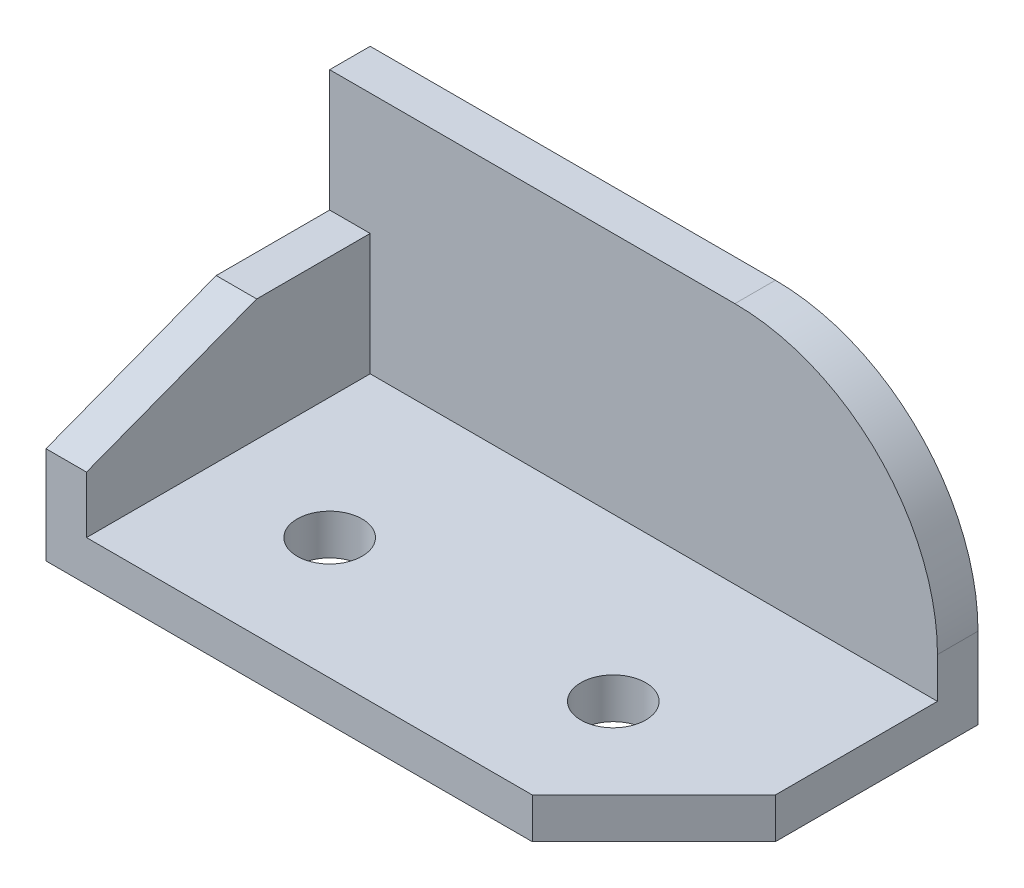
ISO-10303-21;
HEADER;
FILE_DESCRIPTION(('STEP AP214'),'2;1');
FILE_NAME('part.step','',(''),(''),'','','');
FILE_SCHEMA(('AUTOMOTIVE_DESIGN { 1 0 10303 214 1 1 1 1 }'));
ENDSEC;
DATA;
#1=APPLICATION_CONTEXT('core data for automotive mechanical design processes');
#2=APPLICATION_PROTOCOL_DEFINITION('international standard','automotive_design',2000,#1);
#3=PRODUCT_CONTEXT('',#1,'mechanical');
#4=PRODUCT('Part','Part','',(#3));
#5=PRODUCT_RELATED_PRODUCT_CATEGORY('part','',(#4));
#6=PRODUCT_DEFINITION_FORMATION('','',#4);
#7=PRODUCT_DEFINITION_CONTEXT('part definition',#1,'design');
#8=PRODUCT_DEFINITION('design','',#6,#7);
#9=PRODUCT_DEFINITION_SHAPE('','',#8);
#10=(LENGTH_UNIT() NAMED_UNIT(*) SI_UNIT(.MILLI.,.METRE.));
#11=(NAMED_UNIT(*) PLANE_ANGLE_UNIT() SI_UNIT($,.RADIAN.));
#12=(NAMED_UNIT(*) SI_UNIT($,.STERADIAN.) SOLID_ANGLE_UNIT());
#13=UNCERTAINTY_MEASURE_WITH_UNIT(LENGTH_MEASURE(1.E-05),#10,'distance_accuracy_value','');
#14=(GEOMETRIC_REPRESENTATION_CONTEXT(3) GLOBAL_UNCERTAINTY_ASSIGNED_CONTEXT((#13)) GLOBAL_UNIT_ASSIGNED_CONTEXT((#10,
#11,#12)) REPRESENTATION_CONTEXT('',''));
#15=CARTESIAN_POINT('',(0.,0.,0.));
#16=DIRECTION('',(0.,0.,1.));
#17=DIRECTION('',(1.,0.,0.));
#18=AXIS2_PLACEMENT_3D('',#15,#16,#17);
#19=CARTESIAN_POINT('',(0.,5.,0.));
#20=DIRECTION('',(0.,-1.,0.));
#21=DIRECTION('',(0.,0.,-1.));
#22=AXIS2_PLACEMENT_3D('',#19,#20,#21);
#23=PLANE('',#22);
#24=CARTESIAN_POINT('',(20.,5.,25.));
#25=DIRECTION('',(0.,1.,0.));
#26=DIRECTION('',(0.,0.,1.));
#27=AXIS2_PLACEMENT_3D('',#24,#25,#26);
#28=CIRCLE('',#27,4.);
#29=CARTESIAN_POINT('',(20.,5.,29.));
#30=VERTEX_POINT('',#29);
#31=EDGE_CURVE('E217',#30,#30,#28,.T.);
#32=ORIENTED_EDGE('',*,*,#31,.F.);
#33=EDGE_LOOP('',(#32));
#34=FACE_BOUND('',#33,.T.);
#35=CARTESIAN_POINT('',(55.,5.,25.));
#36=DIRECTION('',(0.,1.,0.));
#37=DIRECTION('',(0.,0.,1.));
#38=AXIS2_PLACEMENT_3D('',#35,#36,#37);
#39=CIRCLE('',#38,4.00000000000001);
#40=CARTESIAN_POINT('',(55.,5.,29.));
#41=VERTEX_POINT('',#40);
#42=EDGE_CURVE('E209',#41,#41,#39,.T.);
#43=ORIENTED_EDGE('',*,*,#42,.F.);
#44=EDGE_LOOP('',(#43));
#45=FACE_BOUND('',#44,.T.);
#46=DIRECTION('',(1.,0.,0.));
#47=VECTOR('',#46,1.);
#48=CARTESIAN_POINT('',(0.,5.,5.));
#49=LINE('',#48,#47);
#50=CARTESIAN_POINT('',(5.,5.,5.));
#51=VERTEX_POINT('',#50);
#52=CARTESIAN_POINT('',(75.,5.,5.));
#53=VERTEX_POINT('',#52);
#54=EDGE_CURVE('E135',#51,#53,#49,.T.);
#55=ORIENTED_EDGE('',*,*,#54,.F.);
#56=DIRECTION('',(0.,0.,-1.));
#57=VECTOR('',#56,1.);
#58=CARTESIAN_POINT('',(5.,5.,0.));
#59=LINE('',#58,#57);
#60=CARTESIAN_POINT('',(5.,5.,40.));
#61=VERTEX_POINT('',#60);
#62=EDGE_CURVE('E180',#61,#51,#59,.T.);
#63=ORIENTED_EDGE('',*,*,#62,.F.);
#64=DIRECTION('',(1.,0.,0.));
#65=VECTOR('',#64,1.);
#66=CARTESIAN_POINT('',(60.,5.,40.));
#67=LINE('',#66,#65);
#68=CARTESIAN_POINT('',(60.,5.,40.));
#69=VERTEX_POINT('',#68);
#70=EDGE_CURVE('E225',#61,#69,#67,.T.);
#71=ORIENTED_EDGE('',*,*,#70,.T.);
#72=DIRECTION('',(0.707106781186547,0.,-0.707106781186548));
#73=VECTOR('',#72,1.);
#74=CARTESIAN_POINT('',(75.,5.,25.));
#75=LINE('',#74,#73);
#76=CARTESIAN_POINT('',(75.,5.,25.));
#77=VERTEX_POINT('',#76);
#78=EDGE_CURVE('E228',#69,#77,#75,.T.);
#79=ORIENTED_EDGE('',*,*,#78,.T.);
#80=DIRECTION('',(0.,0.,-1.));
#81=VECTOR('',#80,1.);
#82=CARTESIAN_POINT('',(75.,5.,0.));
#83=LINE('',#82,#81);
#84=EDGE_CURVE('E61',#77,#53,#83,.T.);
#85=ORIENTED_EDGE('',*,*,#84,.T.);
#86=EDGE_LOOP('',(#55,#63,#71,#79,#85));
#87=FACE_BOUND('',#86,.T.);
#88=ADVANCED_FACE('F45',(#34,#45,#87),#23,.F.);
#89=CARTESIAN_POINT('',(5.,20.,19.));
#90=DIRECTION('',(0.,-1.,0.));
#91=DIRECTION('',(0.,0.,-1.));
#92=AXIS2_PLACEMENT_3D('',#89,#90,#91);
#93=PLANE('',#92);
#94=DIRECTION('',(1.,0.,0.));
#95=VECTOR('',#94,1.);
#96=CARTESIAN_POINT('',(5.,20.,5.));
#97=LINE('',#96,#95);
#98=CARTESIAN_POINT('',(0.,20.,5.));
#99=VERTEX_POINT('',#98);
#100=CARTESIAN_POINT('',(5.,20.,5.));
#101=VERTEX_POINT('',#100);
#102=EDGE_CURVE('E69',#99,#101,#97,.T.);
#103=ORIENTED_EDGE('',*,*,#102,.F.);
#104=DIRECTION('',(0.,0.,1.));
#105=VECTOR('',#104,1.);
#106=CARTESIAN_POINT('',(0.,20.,19.));
#107=LINE('',#106,#105);
#108=CARTESIAN_POINT('',(0.,20.,19.));
#109=VERTEX_POINT('',#108);
#110=EDGE_CURVE('E179',#99,#109,#107,.T.);
#111=ORIENTED_EDGE('',*,*,#110,.T.);
#112=DIRECTION('',(-1.,0.,0.));
#113=VECTOR('',#112,1.);
#114=CARTESIAN_POINT('',(5.,20.,19.));
#115=LINE('',#114,#113);
#116=CARTESIAN_POINT('',(5.,20.,19.));
#117=VERTEX_POINT('',#116);
#118=EDGE_CURVE('E204',#117,#109,#115,.T.);
#119=ORIENTED_EDGE('',*,*,#118,.F.);
#120=DIRECTION('',(0.,0.,1.));
#121=VECTOR('',#120,1.);
#122=CARTESIAN_POINT('',(5.,20.,19.));
#123=LINE('',#122,#121);
#124=EDGE_CURVE('E184',#101,#117,#123,.T.);
#125=ORIENTED_EDGE('',*,*,#124,.F.);
#126=EDGE_LOOP('',(#103,#111,#119,#125));
#127=FACE_BOUND('',#126,.T.);
#128=ADVANCED_FACE('F275',(#127),#93,.F.);
#129=CARTESIAN_POINT('',(5.,0.,0.));
#130=DIRECTION('',(-1.,0.,0.));
#131=DIRECTION('',(0.,0.,1.));
#132=AXIS2_PLACEMENT_3D('',#129,#130,#131);
#133=PLANE('',#132);
#134=DIRECTION('',(0.,-1.,0.));
#135=VECTOR('',#134,1.);
#136=CARTESIAN_POINT('',(5.,0.,5.));
#137=LINE('',#136,#135);
#138=EDGE_CURVE('E11',#101,#51,#137,.T.);
#139=ORIENTED_EDGE('',*,*,#138,.F.);
#140=ORIENTED_EDGE('',*,*,#124,.T.);
#141=DIRECTION('',(0.,-0.355995327591988,0.934487734928968));
#142=VECTOR('',#141,1.);
#143=CARTESIAN_POINT('',(5.,12.,40.));
#144=LINE('',#143,#142);
#145=CARTESIAN_POINT('',(5.,12.,40.));
#146=VERTEX_POINT('',#145);
#147=EDGE_CURVE('E188',#117,#146,#144,.T.);
#148=ORIENTED_EDGE('',*,*,#147,.T.);
#149=DIRECTION('',(0.,-1.,0.));
#150=VECTOR('',#149,1.);
#151=CARTESIAN_POINT('',(5.,5.,40.));
#152=LINE('',#151,#150);
#153=EDGE_CURVE('E191',#146,#61,#152,.T.);
#154=ORIENTED_EDGE('',*,*,#153,.T.);
#155=ORIENTED_EDGE('',*,*,#62,.T.);
#156=EDGE_LOOP('',(#139,#140,#148,#154,#155));
#157=FACE_BOUND('',#156,.T.);
#158=ADVANCED_FACE('F313',(#157),#133,.F.);
#159=CARTESIAN_POINT('',(0.,0.,0.));
#160=DIRECTION('',(0.,-1.,0.));
#161=DIRECTION('',(0.,0.,-1.));
#162=AXIS2_PLACEMENT_3D('',#159,#160,#161);
#163=PLANE('',#162);
#164=DIRECTION('',(-1.,0.,0.));
#165=VECTOR('',#164,1.);
#166=CARTESIAN_POINT('',(0.,0.,0.));
#167=LINE('',#166,#165);
#168=CARTESIAN_POINT('',(75.,0.,0.));
#169=VERTEX_POINT('',#168);
#170=CARTESIAN_POINT('',(0.,0.,0.));
#171=VERTEX_POINT('',#170);
#172=EDGE_CURVE('E229',#169,#171,#167,.T.);
#173=ORIENTED_EDGE('',*,*,#172,.F.);
#174=DIRECTION('',(0.,0.,-1.));
#175=VECTOR('',#174,1.);
#176=CARTESIAN_POINT('',(75.,0.,0.));
#177=LINE('',#176,#175);
#178=CARTESIAN_POINT('',(75.,0.,25.));
#179=VERTEX_POINT('',#178);
#180=EDGE_CURVE('E243',#179,#169,#177,.T.);
#181=ORIENTED_EDGE('',*,*,#180,.F.);
#182=DIRECTION('',(0.707106781186547,0.,-0.707106781186548));
#183=VECTOR('',#182,1.);
#184=CARTESIAN_POINT('',(75.,0.,25.));
#185=LINE('',#184,#183);
#186=CARTESIAN_POINT('',(60.,0.,40.));
#187=VERTEX_POINT('',#186);
#188=EDGE_CURVE('E240',#187,#179,#185,.T.);
#189=ORIENTED_EDGE('',*,*,#188,.F.);
#190=DIRECTION('',(1.,0.,0.));
#191=VECTOR('',#190,1.);
#192=CARTESIAN_POINT('',(60.,0.,40.));
#193=LINE('',#192,#191);
#194=CARTESIAN_POINT('',(0.,0.,40.));
#195=VERTEX_POINT('',#194);
#196=EDGE_CURVE('E237',#195,#187,#193,.T.);
#197=ORIENTED_EDGE('',*,*,#196,.F.);
#198=DIRECTION('',(0.,0.,1.));
#199=VECTOR('',#198,1.);
#200=CARTESIAN_POINT('',(0.,0.,40.));
#201=LINE('',#200,#199);
#202=EDGE_CURVE('E221',#171,#195,#201,.T.);
#203=ORIENTED_EDGE('',*,*,#202,.F.);
#204=EDGE_LOOP('',(#173,#181,#189,#197,#203));
#205=FACE_BOUND('',#204,.T.);
#206=CARTESIAN_POINT('',(20.,0.,25.));
#207=DIRECTION('',(0.,1.,0.));
#208=DIRECTION('',(0.,0.,1.));
#209=AXIS2_PLACEMENT_3D('',#206,#207,#208);
#210=CIRCLE('',#209,4.);
#211=CARTESIAN_POINT('',(20.,0.,29.));
#212=VERTEX_POINT('',#211);
#213=EDGE_CURVE('E213',#212,#212,#210,.T.);
#214=ORIENTED_EDGE('',*,*,#213,.T.);
#215=EDGE_LOOP('',(#214));
#216=FACE_BOUND('',#215,.T.);
#217=CARTESIAN_POINT('',(55.,0.,25.));
#218=DIRECTION('',(0.,1.,0.));
#219=DIRECTION('',(0.,0.,1.));
#220=AXIS2_PLACEMENT_3D('',#217,#218,#219);
#221=CIRCLE('',#220,4.00000000000001);
#222=CARTESIAN_POINT('',(55.,0.,29.));
#223=VERTEX_POINT('',#222);
#224=EDGE_CURVE('E208',#223,#223,#221,.T.);
#225=ORIENTED_EDGE('',*,*,#224,.T.);
#226=EDGE_LOOP('',(#225));
#227=FACE_BOUND('',#226,.T.);
#228=ADVANCED_FACE('F284',(#205,#216,#227),#163,.T.);
#229=CARTESIAN_POINT('',(0.,5.,40.));
#230=DIRECTION('',(1.,0.,0.));
#231=DIRECTION('',(0.,0.,-1.));
#232=AXIS2_PLACEMENT_3D('',#229,#230,#231);
#233=PLANE('',#232);
#234=ORIENTED_EDGE('',*,*,#202,.T.);
#235=DIRECTION('',(0.,-1.,0.));
#236=VECTOR('',#235,1.);
#237=CARTESIAN_POINT('',(0.,5.,40.));
#238=LINE('',#237,#236);
#239=CARTESIAN_POINT('',(0.,12.,40.));
#240=VERTEX_POINT('',#239);
#241=EDGE_CURVE('E54',#240,#195,#238,.T.);
#242=ORIENTED_EDGE('',*,*,#241,.F.);
#243=DIRECTION('',(0.,-0.355995327591988,0.934487734928968));
#244=VECTOR('',#243,1.);
#245=CARTESIAN_POINT('',(0.,12.,40.));
#246=LINE('',#245,#244);
#247=EDGE_CURVE('E185',#109,#240,#246,.T.);
#248=ORIENTED_EDGE('',*,*,#247,.F.);
#249=ORIENTED_EDGE('',*,*,#110,.F.);
#250=DIRECTION('',(0.,-1.,0.));
#251=VECTOR('',#250,1.);
#252=CARTESIAN_POINT('',(0.,35.,5.));
#253=LINE('',#252,#251);
#254=CARTESIAN_POINT('',(0.,35.,5.));
#255=VERTEX_POINT('',#254);
#256=EDGE_CURVE('E157',#255,#99,#253,.T.);
#257=ORIENTED_EDGE('',*,*,#256,.F.);
#258=DIRECTION('',(0.,0.,-1.));
#259=VECTOR('',#258,1.);
#260=CARTESIAN_POINT('',(0.,35.,5.));
#261=LINE('',#260,#259);
#262=CARTESIAN_POINT('',(0.,35.,0.));
#263=VERTEX_POINT('',#262);
#264=EDGE_CURVE('E163',#255,#263,#261,.T.);
#265=ORIENTED_EDGE('',*,*,#264,.T.);
#266=DIRECTION('',(0.,-1.,0.));
#267=VECTOR('',#266,1.);
#268=CARTESIAN_POINT('',(0.,5.,0.));
#269=LINE('',#268,#267);
#270=EDGE_CURVE('E234',#263,#171,#269,.T.);
#271=ORIENTED_EDGE('',*,*,#270,.T.);
#272=EDGE_LOOP('',(#234,#242,#248,#249,#257,#265,#271));
#273=FACE_BOUND('',#272,.T.);
#274=ADVANCED_FACE('F47',(#273),#233,.F.);
#275=CARTESIAN_POINT('',(60.,5.,40.));
#276=DIRECTION('',(0.,0.,-1.));
#277=DIRECTION('',(-1.,0.,0.));
#278=AXIS2_PLACEMENT_3D('',#275,#276,#277);
#279=PLANE('',#278);
#280=ORIENTED_EDGE('',*,*,#196,.T.);
#281=DIRECTION('',(0.,-1.,0.));
#282=VECTOR('',#281,1.);
#283=CARTESIAN_POINT('',(60.,5.,40.));
#284=LINE('',#283,#282);
#285=EDGE_CURVE('E257',#69,#187,#284,.T.);
#286=ORIENTED_EDGE('',*,*,#285,.F.);
#287=ORIENTED_EDGE('',*,*,#70,.F.);
#288=ORIENTED_EDGE('',*,*,#153,.F.);
#289=DIRECTION('',(-1.,0.,0.));
#290=VECTOR('',#289,1.);
#291=CARTESIAN_POINT('',(5.,12.,40.));
#292=LINE('',#291,#290);
#293=EDGE_CURVE('E195',#146,#240,#292,.T.);
#294=ORIENTED_EDGE('',*,*,#293,.T.);
#295=ORIENTED_EDGE('',*,*,#241,.T.);
#296=EDGE_LOOP('',(#280,#286,#287,#288,#294,#295));
#297=FACE_BOUND('',#296,.T.);
#298=ADVANCED_FACE('F263',(#297),#279,.F.);
#299=CARTESIAN_POINT('',(75.,5.,25.));
#300=DIRECTION('',(-0.707106781186548,0.,-0.707106781186547));
#301=DIRECTION('',(-0.707106781186547,0.,0.707106781186548));
#302=AXIS2_PLACEMENT_3D('',#299,#300,#301);
#303=PLANE('',#302);
#304=ORIENTED_EDGE('',*,*,#188,.T.);
#305=DIRECTION('',(0.,-1.,0.));
#306=VECTOR('',#305,1.);
#307=CARTESIAN_POINT('',(75.,5.,25.));
#308=LINE('',#307,#306);
#309=EDGE_CURVE('E253',#77,#179,#308,.T.);
#310=ORIENTED_EDGE('',*,*,#309,.F.);
#311=ORIENTED_EDGE('',*,*,#78,.F.);
#312=ORIENTED_EDGE('',*,*,#285,.T.);
#313=EDGE_LOOP('',(#304,#310,#311,#312));
#314=FACE_BOUND('',#313,.T.);
#315=ADVANCED_FACE('F290',(#314),#303,.F.);
#316=CARTESIAN_POINT('',(75.,5.,0.));
#317=DIRECTION('',(-1.,0.,0.));
#318=DIRECTION('',(0.,0.,1.));
#319=AXIS2_PLACEMENT_3D('',#316,#317,#318);
#320=PLANE('',#319);
#321=DIRECTION('',(0.,-1.,0.));
#322=VECTOR('',#321,1.);
#323=CARTESIAN_POINT('',(75.,5.,0.));
#324=LINE('',#323,#322);
#325=CARTESIAN_POINT('',(75.,10.,0.));
#326=VERTEX_POINT('',#325);
#327=EDGE_CURVE('E144',#326,#169,#324,.T.);
#328=ORIENTED_EDGE('',*,*,#327,.F.);
#329=DIRECTION('',(0.,0.,-1.));
#330=VECTOR('',#329,1.);
#331=CARTESIAN_POINT('',(75.,10.,5.));
#332=LINE('',#331,#330);
#333=CARTESIAN_POINT('',(75.,10.,5.));
#334=VERTEX_POINT('',#333);
#335=EDGE_CURVE('E141',#334,#326,#332,.T.);
#336=ORIENTED_EDGE('',*,*,#335,.F.);
#337=DIRECTION('',(0.,1.,0.));
#338=VECTOR('',#337,1.);
#339=CARTESIAN_POINT('',(75.,10.,5.));
#340=LINE('',#339,#338);
#341=EDGE_CURVE('E129',#53,#334,#340,.T.);
#342=ORIENTED_EDGE('',*,*,#341,.F.);
#343=ORIENTED_EDGE('',*,*,#84,.F.);
#344=ORIENTED_EDGE('',*,*,#309,.T.);
#345=ORIENTED_EDGE('',*,*,#180,.T.);
#346=EDGE_LOOP('',(#328,#336,#342,#343,#344,#345));
#347=FACE_BOUND('',#346,.T.);
#348=ADVANCED_FACE('F142',(#347),#320,.F.);
#349=CARTESIAN_POINT('',(0.,5.,0.));
#350=DIRECTION('',(0.,0.,1.));
#351=DIRECTION('',(1.,0.,0.));
#352=AXIS2_PLACEMENT_3D('',#349,#350,#351);
#353=PLANE('',#352);
#354=ORIENTED_EDGE('',*,*,#270,.F.);
#355=DIRECTION('',(-1.,0.,0.));
#356=VECTOR('',#355,1.);
#357=CARTESIAN_POINT('',(0.,35.,0.));
#358=LINE('',#357,#356);
#359=CARTESIAN_POINT('',(50.,35.,0.));
#360=VERTEX_POINT('',#359);
#361=EDGE_CURVE('E138',#360,#263,#358,.T.);
#362=ORIENTED_EDGE('',*,*,#361,.F.);
#363=CARTESIAN_POINT('',(50.,10.,0.));
#364=DIRECTION('',(0.,0.,1.));
#365=DIRECTION('',(-1.,0.,0.));
#366=AXIS2_PLACEMENT_3D('',#363,#364,#365);
#367=CIRCLE('',#366,25.);
#368=EDGE_CURVE('E164',#326,#360,#367,.T.);
#369=ORIENTED_EDGE('',*,*,#368,.F.);
#370=ORIENTED_EDGE('',*,*,#327,.T.);
#371=ORIENTED_EDGE('',*,*,#172,.T.);
#372=EDGE_LOOP('',(#354,#362,#369,#370,#371));
#373=FACE_BOUND('',#372,.T.);
#374=ADVANCED_FACE('F292',(#373),#353,.F.);
#375=CARTESIAN_POINT('',(20.,5.,25.));
#376=DIRECTION('',(0.,-1.,0.));
#377=DIRECTION('',(0.,0.,-1.));
#378=AXIS2_PLACEMENT_3D('',#375,#376,#377);
#379=CYLINDRICAL_SURFACE('',#378,4.);
#380=ORIENTED_EDGE('',*,*,#31,.T.);
#381=EDGE_LOOP('',(#380));
#382=FACE_BOUND('',#381,.T.);
#383=ORIENTED_EDGE('',*,*,#213,.F.);
#384=EDGE_LOOP('',(#383));
#385=FACE_BOUND('',#384,.T.);
#386=ADVANCED_FACE('F294',(#382,#385),#379,.F.);
#387=CARTESIAN_POINT('',(55.,5.,25.));
#388=DIRECTION('',(0.,-1.,0.));
#389=DIRECTION('',(0.,0.,-1.));
#390=AXIS2_PLACEMENT_3D('',#387,#388,#389);
#391=CYLINDRICAL_SURFACE('',#390,4.00000000000001);
#392=ORIENTED_EDGE('',*,*,#42,.T.);
#393=EDGE_LOOP('',(#392));
#394=FACE_BOUND('',#393,.T.);
#395=ORIENTED_EDGE('',*,*,#224,.F.);
#396=EDGE_LOOP('',(#395));
#397=FACE_BOUND('',#396,.T.);
#398=ADVANCED_FACE('F301',(#394,#397),#391,.F.);
#399=CARTESIAN_POINT('',(5.,12.,40.));
#400=DIRECTION('',(0.,-0.934487734928968,-0.355995327591988));
#401=DIRECTION('',(0.,0.355995327591988,-0.934487734928968));
#402=AXIS2_PLACEMENT_3D('',#399,#400,#401);
#403=PLANE('',#402);
#404=ORIENTED_EDGE('',*,*,#247,.T.);
#405=ORIENTED_EDGE('',*,*,#293,.F.);
#406=ORIENTED_EDGE('',*,*,#147,.F.);
#407=ORIENTED_EDGE('',*,*,#118,.T.);
#408=EDGE_LOOP('',(#404,#405,#406,#407));
#409=FACE_BOUND('',#408,.T.);
#410=ADVANCED_FACE('F272',(#409),#403,.F.);
#411=CARTESIAN_POINT('',(50.,10.,5.));
#412=DIRECTION('',(0.,0.,-1.));
#413=DIRECTION('',(-1.,0.,0.));
#414=AXIS2_PLACEMENT_3D('',#411,#412,#413);
#415=PLANE('',#414);
#416=ORIENTED_EDGE('',*,*,#138,.T.);
#417=ORIENTED_EDGE('',*,*,#54,.T.);
#418=ORIENTED_EDGE('',*,*,#341,.T.);
#419=CARTESIAN_POINT('',(50.,10.,5.));
#420=DIRECTION('',(0.,0.,1.));
#421=DIRECTION('',(-1.,0.,0.));
#422=AXIS2_PLACEMENT_3D('',#419,#420,#421);
#423=CIRCLE('',#422,25.);
#424=CARTESIAN_POINT('',(50.,35.,5.));
#425=VERTEX_POINT('',#424);
#426=EDGE_CURVE('E133',#334,#425,#423,.T.);
#427=ORIENTED_EDGE('',*,*,#426,.T.);
#428=DIRECTION('',(-1.,0.,0.));
#429=VECTOR('',#428,1.);
#430=CARTESIAN_POINT('',(0.,35.,5.));
#431=LINE('',#430,#429);
#432=EDGE_CURVE('E154',#425,#255,#431,.T.);
#433=ORIENTED_EDGE('',*,*,#432,.T.);
#434=ORIENTED_EDGE('',*,*,#256,.T.);
#435=ORIENTED_EDGE('',*,*,#102,.T.);
#436=EDGE_LOOP('',(#416,#417,#418,#427,#433,#434,#435));
#437=FACE_BOUND('',#436,.T.);
#438=ADVANCED_FACE('F131',(#437),#415,.F.);
#439=CARTESIAN_POINT('',(50.,10.,5.));
#440=DIRECTION('',(0.,0.,-1.));
#441=DIRECTION('',(-1.,0.,0.));
#442=AXIS2_PLACEMENT_3D('',#439,#440,#441);
#443=CYLINDRICAL_SURFACE('',#442,25.);
#444=ORIENTED_EDGE('',*,*,#368,.T.);
#445=DIRECTION('',(0.,0.,-1.));
#446=VECTOR('',#445,1.);
#447=CARTESIAN_POINT('',(50.,35.,5.));
#448=LINE('',#447,#446);
#449=EDGE_CURVE('E148',#425,#360,#448,.T.);
#450=ORIENTED_EDGE('',*,*,#449,.F.);
#451=ORIENTED_EDGE('',*,*,#426,.F.);
#452=ORIENTED_EDGE('',*,*,#335,.T.);
#453=EDGE_LOOP('',(#444,#450,#451,#452));
#454=FACE_BOUND('',#453,.T.);
#455=ADVANCED_FACE('F150',(#454),#443,.T.);
#456=CARTESIAN_POINT('',(0.,35.,5.));
#457=DIRECTION('',(0.,-1.,0.));
#458=DIRECTION('',(0.,0.,-1.));
#459=AXIS2_PLACEMENT_3D('',#456,#457,#458);
#460=PLANE('',#459);
#461=ORIENTED_EDGE('',*,*,#361,.T.);
#462=ORIENTED_EDGE('',*,*,#264,.F.);
#463=ORIENTED_EDGE('',*,*,#432,.F.);
#464=ORIENTED_EDGE('',*,*,#449,.T.);
#465=EDGE_LOOP('',(#461,#462,#463,#464));
#466=FACE_BOUND('',#465,.T.);
#467=ADVANCED_FACE('F279',(#466),#460,.F.);
#468=CLOSED_SHELL('',(#88,#128,#158,#228,#274,#298,#315,#348,#374,#386,#398,#410,#438,#455,#467));
#469=MANIFOLD_SOLID_BREP('B2',#468);
#470=ADVANCED_BREP_SHAPE_REPRESENTATION('',(#18,#469),#14);
#471=SHAPE_DEFINITION_REPRESENTATION(#9,#470);
ENDSEC;
END-ISO-10303-21;
